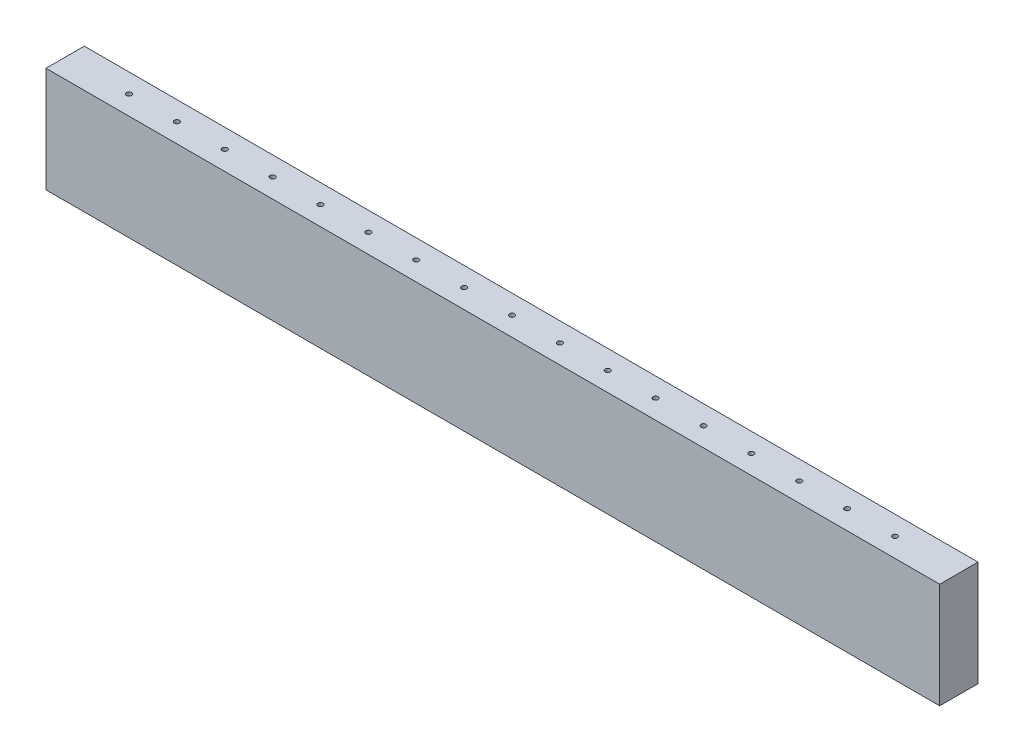
ISO-10303-21;
HEADER;
FILE_DESCRIPTION(('STEP AP214'),'2;1');
FILE_NAME('part.step','',(''),(''),'','','');
FILE_SCHEMA(('AUTOMOTIVE_DESIGN { 1 0 10303 214 1 1 1 1 }'));
ENDSEC;
DATA;
#1=APPLICATION_CONTEXT('core data for automotive mechanical design processes');
#2=APPLICATION_PROTOCOL_DEFINITION('international standard','automotive_design',2000,#1);
#3=PRODUCT_CONTEXT('',#1,'mechanical');
#4=PRODUCT('Part','Part','',(#3));
#5=PRODUCT_RELATED_PRODUCT_CATEGORY('part','',(#4));
#6=PRODUCT_DEFINITION_FORMATION('','',#4);
#7=PRODUCT_DEFINITION_CONTEXT('part definition',#1,'design');
#8=PRODUCT_DEFINITION('design','',#6,#7);
#9=PRODUCT_DEFINITION_SHAPE('','',#8);
#10=(LENGTH_UNIT() NAMED_UNIT(*) SI_UNIT(.MILLI.,.METRE.));
#11=(NAMED_UNIT(*) PLANE_ANGLE_UNIT() SI_UNIT($,.RADIAN.));
#12=(NAMED_UNIT(*) SI_UNIT($,.STERADIAN.) SOLID_ANGLE_UNIT());
#13=UNCERTAINTY_MEASURE_WITH_UNIT(LENGTH_MEASURE(1.E-05),#10,'distance_accuracy_value','');
#14=(GEOMETRIC_REPRESENTATION_CONTEXT(3) GLOBAL_UNCERTAINTY_ASSIGNED_CONTEXT((#13)) GLOBAL_UNIT_ASSIGNED_CONTEXT((#10,
#11,#12)) REPRESENTATION_CONTEXT('',''));
#15=CARTESIAN_POINT('',(0.,0.,0.));
#16=DIRECTION('',(0.,0.,1.));
#17=DIRECTION('',(1.,0.,0.));
#18=AXIS2_PLACEMENT_3D('',#15,#16,#17);
#19=CARTESIAN_POINT('',(140.,33.,-6.));
#20=DIRECTION('',(-1.,0.,0.));
#21=DIRECTION('',(0.,0.,1.));
#22=AXIS2_PLACEMENT_3D('',#19,#20,#21);
#23=PLANE('',#22);
#24=DIRECTION('',(0.,0.,-1.));
#25=VECTOR('',#24,1.);
#26=CARTESIAN_POINT('',(140.,0.,-6.));
#27=LINE('',#26,#25);
#28=CARTESIAN_POINT('',(140.,0.,6.));
#29=VERTEX_POINT('',#28);
#30=CARTESIAN_POINT('',(140.,0.,-6.));
#31=VERTEX_POINT('',#30);
#32=EDGE_CURVE('E311',#29,#31,#27,.T.);
#33=ORIENTED_EDGE('',*,*,#32,.T.);
#34=DIRECTION('',(0.,-1.,0.));
#35=VECTOR('',#34,1.);
#36=CARTESIAN_POINT('',(140.,33.,-6.));
#37=LINE('',#36,#35);
#38=CARTESIAN_POINT('',(140.,33.,-6.));
#39=VERTEX_POINT('',#38);
#40=EDGE_CURVE('E11',#39,#31,#37,.T.);
#41=ORIENTED_EDGE('',*,*,#40,.F.);
#42=DIRECTION('',(0.,0.,-1.));
#43=VECTOR('',#42,1.);
#44=CARTESIAN_POINT('',(140.,33.,-6.));
#45=LINE('',#44,#43);
#46=CARTESIAN_POINT('',(140.,33.,6.));
#47=VERTEX_POINT('',#46);
#48=EDGE_CURVE('E312',#47,#39,#45,.T.);
#49=ORIENTED_EDGE('',*,*,#48,.F.);
#50=DIRECTION('',(0.,-1.,0.));
#51=VECTOR('',#50,1.);
#52=CARTESIAN_POINT('',(140.,33.,6.));
#53=LINE('',#52,#51);
#54=EDGE_CURVE('E322',#47,#29,#53,.T.);
#55=ORIENTED_EDGE('',*,*,#54,.T.);
#56=EDGE_LOOP('',(#33,#41,#49,#55));
#57=FACE_BOUND('',#56,.T.);
#58=ADVANCED_FACE('F44',(#57),#23,.F.);
#59=CARTESIAN_POINT('',(-140.,33.,-6.));
#60=DIRECTION('',(0.,0.,1.));
#61=DIRECTION('',(1.,0.,0.));
#62=AXIS2_PLACEMENT_3D('',#59,#60,#61);
#63=PLANE('',#62);
#64=DIRECTION('',(-1.,0.,0.));
#65=VECTOR('',#64,1.);
#66=CARTESIAN_POINT('',(-140.,0.,-6.));
#67=LINE('',#66,#65);
#68=CARTESIAN_POINT('',(-140.,0.,-6.));
#69=VERTEX_POINT('',#68);
#70=EDGE_CURVE('E326',#31,#69,#67,.T.);
#71=ORIENTED_EDGE('',*,*,#70,.T.);
#72=DIRECTION('',(0.,-1.,0.));
#73=VECTOR('',#72,1.);
#74=CARTESIAN_POINT('',(-140.,33.,-6.));
#75=LINE('',#74,#73);
#76=CARTESIAN_POINT('',(-140.,33.,-6.));
#77=VERTEX_POINT('',#76);
#78=EDGE_CURVE('E53',#77,#69,#75,.T.);
#79=ORIENTED_EDGE('',*,*,#78,.F.);
#80=DIRECTION('',(-1.,0.,0.));
#81=VECTOR('',#80,1.);
#82=CARTESIAN_POINT('',(-140.,33.,-6.));
#83=LINE('',#82,#81);
#84=EDGE_CURVE('E92',#39,#77,#83,.T.);
#85=ORIENTED_EDGE('',*,*,#84,.F.);
#86=ORIENTED_EDGE('',*,*,#40,.T.);
#87=EDGE_LOOP('',(#71,#79,#85,#86));
#88=FACE_BOUND('',#87,.T.);
#89=ADVANCED_FACE('F357',(#88),#63,.F.);
#90=CARTESIAN_POINT('',(-140.,33.,-6.));
#91=DIRECTION('',(1.,0.,0.));
#92=DIRECTION('',(0.,0.,-1.));
#93=AXIS2_PLACEMENT_3D('',#90,#91,#92);
#94=PLANE('',#93);
#95=DIRECTION('',(0.,0.,1.));
#96=VECTOR('',#95,1.);
#97=CARTESIAN_POINT('',(-140.,0.,-6.));
#98=LINE('',#97,#96);
#99=CARTESIAN_POINT('',(-140.,0.,6.));
#100=VERTEX_POINT('',#99);
#101=EDGE_CURVE('E79',#69,#100,#98,.T.);
#102=ORIENTED_EDGE('',*,*,#101,.T.);
#103=DIRECTION('',(0.,-1.,0.));
#104=VECTOR('',#103,1.);
#105=CARTESIAN_POINT('',(-140.,33.,6.));
#106=LINE('',#105,#104);
#107=CARTESIAN_POINT('',(-140.,33.,6.));
#108=VERTEX_POINT('',#107);
#109=EDGE_CURVE('E335',#108,#100,#106,.T.);
#110=ORIENTED_EDGE('',*,*,#109,.F.);
#111=DIRECTION('',(0.,0.,1.));
#112=VECTOR('',#111,1.);
#113=CARTESIAN_POINT('',(-140.,33.,-6.));
#114=LINE('',#113,#112);
#115=EDGE_CURVE('E317',#77,#108,#114,.T.);
#116=ORIENTED_EDGE('',*,*,#115,.F.);
#117=ORIENTED_EDGE('',*,*,#78,.T.);
#118=EDGE_LOOP('',(#102,#110,#116,#117));
#119=FACE_BOUND('',#118,.T.);
#120=ADVANCED_FACE('F339',(#119),#94,.F.);
#121=CARTESIAN_POINT('',(-140.,33.,6.));
#122=DIRECTION('',(0.,0.,-1.));
#123=DIRECTION('',(-1.,0.,0.));
#124=AXIS2_PLACEMENT_3D('',#121,#122,#123);
#125=PLANE('',#124);
#126=DIRECTION('',(1.,0.,0.));
#127=VECTOR('',#126,1.);
#128=CARTESIAN_POINT('',(-140.,0.,6.));
#129=LINE('',#128,#127);
#130=EDGE_CURVE('E85',#100,#29,#129,.T.);
#131=ORIENTED_EDGE('',*,*,#130,.T.);
#132=ORIENTED_EDGE('',*,*,#54,.F.);
#133=DIRECTION('',(1.,0.,0.));
#134=VECTOR('',#133,1.);
#135=CARTESIAN_POINT('',(-140.,33.,6.));
#136=LINE('',#135,#134);
#137=EDGE_CURVE('E61',#108,#47,#136,.T.);
#138=ORIENTED_EDGE('',*,*,#137,.F.);
#139=ORIENTED_EDGE('',*,*,#109,.T.);
#140=EDGE_LOOP('',(#131,#132,#138,#139));
#141=FACE_BOUND('',#140,.T.);
#142=ADVANCED_FACE('F346',(#141),#125,.F.);
#143=CARTESIAN_POINT('',(0.,33.,0.));
#144=DIRECTION('',(0.,1.,0.));
#145=DIRECTION('',(0.,0.,1.));
#146=AXIS2_PLACEMENT_3D('',#143,#144,#145);
#147=PLANE('',#146);
#148=CARTESIAN_POINT('',(120.,33.,0.));
#149=DIRECTION('',(0.,1.,0.));
#150=DIRECTION('',(0.,0.,1.));
#151=AXIS2_PLACEMENT_3D('',#148,#149,#150);
#152=CIRCLE('',#151,0.799999999999995);
#153=CARTESIAN_POINT('',(120.,33.,0.799999999999995));
#154=VERTEX_POINT('',#153);
#155=EDGE_CURVE('E175',#154,#154,#152,.T.);
#156=ORIENTED_EDGE('',*,*,#155,.F.);
#157=EDGE_LOOP('',(#156));
#158=FACE_BOUND('',#157,.T.);
#159=CARTESIAN_POINT('',(105.,33.,0.));
#160=DIRECTION('',(0.,1.,0.));
#161=DIRECTION('',(0.,0.,1.));
#162=AXIS2_PLACEMENT_3D('',#159,#160,#161);
#163=CIRCLE('',#162,0.799999999999995);
#164=CARTESIAN_POINT('',(105.,33.,0.799999999999995));
#165=VERTEX_POINT('',#164);
#166=EDGE_CURVE('E183',#165,#165,#163,.T.);
#167=ORIENTED_EDGE('',*,*,#166,.F.);
#168=EDGE_LOOP('',(#167));
#169=FACE_BOUND('',#168,.T.);
#170=CARTESIAN_POINT('',(90.,33.,0.));
#171=DIRECTION('',(0.,1.,0.));
#172=DIRECTION('',(0.,0.,1.));
#173=AXIS2_PLACEMENT_3D('',#170,#171,#172);
#174=CIRCLE('',#173,0.799999999999995);
#175=CARTESIAN_POINT('',(90.,33.,0.799999999999995));
#176=VERTEX_POINT('',#175);
#177=EDGE_CURVE('E191',#176,#176,#174,.T.);
#178=ORIENTED_EDGE('',*,*,#177,.F.);
#179=EDGE_LOOP('',(#178));
#180=FACE_BOUND('',#179,.T.);
#181=CARTESIAN_POINT('',(75.,33.,0.));
#182=DIRECTION('',(0.,1.,0.));
#183=DIRECTION('',(0.,0.,1.));
#184=AXIS2_PLACEMENT_3D('',#181,#182,#183);
#185=CIRCLE('',#184,0.799999999999995);
#186=CARTESIAN_POINT('',(75.,33.,0.799999999999995));
#187=VERTEX_POINT('',#186);
#188=EDGE_CURVE('E199',#187,#187,#185,.T.);
#189=ORIENTED_EDGE('',*,*,#188,.F.);
#190=EDGE_LOOP('',(#189));
#191=FACE_BOUND('',#190,.T.);
#192=CARTESIAN_POINT('',(60.,33.,0.));
#193=DIRECTION('',(0.,1.,0.));
#194=DIRECTION('',(0.,0.,1.));
#195=AXIS2_PLACEMENT_3D('',#192,#193,#194);
#196=CIRCLE('',#195,0.799999999999995);
#197=CARTESIAN_POINT('',(60.,33.,0.799999999999995));
#198=VERTEX_POINT('',#197);
#199=EDGE_CURVE('E207',#198,#198,#196,.T.);
#200=ORIENTED_EDGE('',*,*,#199,.F.);
#201=EDGE_LOOP('',(#200));
#202=FACE_BOUND('',#201,.T.);
#203=CARTESIAN_POINT('',(45.,33.,0.));
#204=DIRECTION('',(0.,1.,0.));
#205=DIRECTION('',(0.,0.,1.));
#206=AXIS2_PLACEMENT_3D('',#203,#204,#205);
#207=CIRCLE('',#206,0.799999999999995);
#208=CARTESIAN_POINT('',(45.,33.,0.799999999999995));
#209=VERTEX_POINT('',#208);
#210=EDGE_CURVE('E215',#209,#209,#207,.T.);
#211=ORIENTED_EDGE('',*,*,#210,.F.);
#212=EDGE_LOOP('',(#211));
#213=FACE_BOUND('',#212,.T.);
#214=CARTESIAN_POINT('',(30.,33.,0.));
#215=DIRECTION('',(0.,1.,0.));
#216=DIRECTION('',(0.,0.,1.));
#217=AXIS2_PLACEMENT_3D('',#214,#215,#216);
#218=CIRCLE('',#217,0.799999999999999);
#219=CARTESIAN_POINT('',(30.,33.,0.799999999999999));
#220=VERTEX_POINT('',#219);
#221=EDGE_CURVE('E223',#220,#220,#218,.T.);
#222=ORIENTED_EDGE('',*,*,#221,.F.);
#223=EDGE_LOOP('',(#222));
#224=FACE_BOUND('',#223,.T.);
#225=CARTESIAN_POINT('',(15.,33.,0.));
#226=DIRECTION('',(0.,1.,0.));
#227=DIRECTION('',(0.,0.,1.));
#228=AXIS2_PLACEMENT_3D('',#225,#226,#227);
#229=CIRCLE('',#228,0.799999999999999);
#230=CARTESIAN_POINT('',(15.,33.,0.799999999999999));
#231=VERTEX_POINT('',#230);
#232=EDGE_CURVE('E231',#231,#231,#229,.T.);
#233=ORIENTED_EDGE('',*,*,#232,.F.);
#234=EDGE_LOOP('',(#233));
#235=FACE_BOUND('',#234,.T.);
#236=CARTESIAN_POINT('',(-120.,33.,0.));
#237=DIRECTION('',(0.,1.,0.));
#238=DIRECTION('',(0.,0.,1.));
#239=AXIS2_PLACEMENT_3D('',#236,#237,#238);
#240=CIRCLE('',#239,0.799999999999995);
#241=CARTESIAN_POINT('',(-120.,33.,0.799999999999995));
#242=VERTEX_POINT('',#241);
#243=EDGE_CURVE('E239',#242,#242,#240,.T.);
#244=ORIENTED_EDGE('',*,*,#243,.F.);
#245=EDGE_LOOP('',(#244));
#246=FACE_BOUND('',#245,.T.);
#247=CARTESIAN_POINT('',(-105.,33.,0.));
#248=DIRECTION('',(0.,1.,0.));
#249=DIRECTION('',(0.,0.,1.));
#250=AXIS2_PLACEMENT_3D('',#247,#248,#249);
#251=CIRCLE('',#250,0.799999999999995);
#252=CARTESIAN_POINT('',(-105.,33.,0.799999999999995));
#253=VERTEX_POINT('',#252);
#254=EDGE_CURVE('E247',#253,#253,#251,.T.);
#255=ORIENTED_EDGE('',*,*,#254,.F.);
#256=EDGE_LOOP('',(#255));
#257=FACE_BOUND('',#256,.T.);
#258=CARTESIAN_POINT('',(-90.,33.,0.));
#259=DIRECTION('',(0.,1.,0.));
#260=DIRECTION('',(0.,0.,1.));
#261=AXIS2_PLACEMENT_3D('',#258,#259,#260);
#262=CIRCLE('',#261,0.799999999999995);
#263=CARTESIAN_POINT('',(-90.,33.,0.799999999999995));
#264=VERTEX_POINT('',#263);
#265=EDGE_CURVE('E255',#264,#264,#262,.T.);
#266=ORIENTED_EDGE('',*,*,#265,.F.);
#267=EDGE_LOOP('',(#266));
#268=FACE_BOUND('',#267,.T.);
#269=CARTESIAN_POINT('',(-75.,33.,0.));
#270=DIRECTION('',(0.,1.,0.));
#271=DIRECTION('',(0.,0.,1.));
#272=AXIS2_PLACEMENT_3D('',#269,#270,#271);
#273=CIRCLE('',#272,0.799999999999995);
#274=CARTESIAN_POINT('',(-75.,33.,0.799999999999995));
#275=VERTEX_POINT('',#274);
#276=EDGE_CURVE('E263',#275,#275,#273,.T.);
#277=ORIENTED_EDGE('',*,*,#276,.F.);
#278=EDGE_LOOP('',(#277));
#279=FACE_BOUND('',#278,.T.);
#280=CARTESIAN_POINT('',(-60.,33.,0.));
#281=DIRECTION('',(0.,1.,0.));
#282=DIRECTION('',(0.,0.,1.));
#283=AXIS2_PLACEMENT_3D('',#280,#281,#282);
#284=CIRCLE('',#283,0.799999999999995);
#285=CARTESIAN_POINT('',(-60.,33.,0.799999999999995));
#286=VERTEX_POINT('',#285);
#287=EDGE_CURVE('E271',#286,#286,#284,.T.);
#288=ORIENTED_EDGE('',*,*,#287,.F.);
#289=EDGE_LOOP('',(#288));
#290=FACE_BOUND('',#289,.T.);
#291=CARTESIAN_POINT('',(-45.,33.,0.));
#292=DIRECTION('',(0.,1.,0.));
#293=DIRECTION('',(0.,0.,1.));
#294=AXIS2_PLACEMENT_3D('',#291,#292,#293);
#295=CIRCLE('',#294,0.799999999999995);
#296=CARTESIAN_POINT('',(-45.,33.,0.799999999999995));
#297=VERTEX_POINT('',#296);
#298=EDGE_CURVE('E279',#297,#297,#295,.T.);
#299=ORIENTED_EDGE('',*,*,#298,.F.);
#300=EDGE_LOOP('',(#299));
#301=FACE_BOUND('',#300,.T.);
#302=CARTESIAN_POINT('',(-30.,33.,0.));
#303=DIRECTION('',(0.,1.,0.));
#304=DIRECTION('',(0.,0.,1.));
#305=AXIS2_PLACEMENT_3D('',#302,#303,#304);
#306=CIRCLE('',#305,0.799999999999999);
#307=CARTESIAN_POINT('',(-30.,33.,0.799999999999999));
#308=VERTEX_POINT('',#307);
#309=EDGE_CURVE('E287',#308,#308,#306,.T.);
#310=ORIENTED_EDGE('',*,*,#309,.F.);
#311=EDGE_LOOP('',(#310));
#312=FACE_BOUND('',#311,.T.);
#313=CARTESIAN_POINT('',(-15.,33.,0.));
#314=DIRECTION('',(0.,1.,0.));
#315=DIRECTION('',(0.,0.,1.));
#316=AXIS2_PLACEMENT_3D('',#313,#314,#315);
#317=CIRCLE('',#316,0.799999999999997);
#318=CARTESIAN_POINT('',(-15.,33.,0.799999999999997));
#319=VERTEX_POINT('',#318);
#320=EDGE_CURVE('E295',#319,#319,#317,.T.);
#321=ORIENTED_EDGE('',*,*,#320,.F.);
#322=EDGE_LOOP('',(#321));
#323=FACE_BOUND('',#322,.T.);
#324=CARTESIAN_POINT('',(0.,33.,0.));
#325=DIRECTION('',(0.,1.,0.));
#326=DIRECTION('',(0.,0.,1.));
#327=AXIS2_PLACEMENT_3D('',#324,#325,#326);
#328=CIRCLE('',#327,0.799999999999997);
#329=CARTESIAN_POINT('',(0.,33.,0.799999999999997));
#330=VERTEX_POINT('',#329);
#331=EDGE_CURVE('E303',#330,#330,#328,.T.);
#332=ORIENTED_EDGE('',*,*,#331,.F.);
#333=EDGE_LOOP('',(#332));
#334=FACE_BOUND('',#333,.T.);
#335=ORIENTED_EDGE('',*,*,#48,.T.);
#336=ORIENTED_EDGE('',*,*,#84,.T.);
#337=ORIENTED_EDGE('',*,*,#115,.T.);
#338=ORIENTED_EDGE('',*,*,#137,.T.);
#339=EDGE_LOOP('',(#335,#336,#337,#338));
#340=FACE_BOUND('',#339,.T.);
#341=ADVANCED_FACE('F348',(#158,#169,#180,#191,#202,#213,#224,#235,#246,#257,#268,#279,#290,
#301,#312,#323,#334,#340),#147,.T.);
#342=CARTESIAN_POINT('',(0.,0.,0.));
#343=DIRECTION('',(0.,1.,0.));
#344=DIRECTION('',(0.,0.,1.));
#345=AXIS2_PLACEMENT_3D('',#342,#343,#344);
#346=PLANE('',#345);
#347=CARTESIAN_POINT('',(120.,0.,0.));
#348=DIRECTION('',(0.,-1.,0.));
#349=DIRECTION('',(0.,0.,-1.));
#350=AXIS2_PLACEMENT_3D('',#347,#348,#349);
#351=CIRCLE('',#350,1.65);
#352=CARTESIAN_POINT('',(120.,0.,-1.65));
#353=VERTEX_POINT('',#352);
#354=EDGE_CURVE('E162',#353,#353,#351,.T.);
#355=ORIENTED_EDGE('',*,*,#354,.F.);
#356=EDGE_LOOP('',(#355));
#357=FACE_BOUND('',#356,.T.);
#358=CARTESIAN_POINT('',(-120.,0.,0.));
#359=DIRECTION('',(0.,-1.,0.));
#360=DIRECTION('',(0.,0.,-1.));
#361=AXIS2_PLACEMENT_3D('',#358,#359,#360);
#362=CIRCLE('',#361,1.65);
#363=CARTESIAN_POINT('',(-120.,0.,-1.65));
#364=VERTEX_POINT('',#363);
#365=EDGE_CURVE('E161',#364,#364,#362,.T.);
#366=ORIENTED_EDGE('',*,*,#365,.F.);
#367=EDGE_LOOP('',(#366));
#368=FACE_BOUND('',#367,.T.);
#369=ORIENTED_EDGE('',*,*,#32,.F.);
#370=ORIENTED_EDGE('',*,*,#130,.F.);
#371=ORIENTED_EDGE('',*,*,#101,.F.);
#372=ORIENTED_EDGE('',*,*,#70,.F.);
#373=EDGE_LOOP('',(#369,#370,#371,#372));
#374=FACE_BOUND('',#373,.T.);
#375=ADVANCED_FACE('F342',(#357,#368,#374),#346,.F.);
#376=CARTESIAN_POINT('',(0.,18.,0.));
#377=DIRECTION('',(0.,1.,0.));
#378=DIRECTION('',(0.,0.,1.));
#379=AXIS2_PLACEMENT_3D('',#376,#377,#378);
#380=CONICAL_SURFACE('',#379,0.799999999999997,1.02974425867665);
#381=CARTESIAN_POINT('',(0.,17.519311504778,0.));
#382=VERTEX_POINT('',#381);
#383=VERTEX_LOOP('',#382);
#384=FACE_BOUND('',#383,.T.);
#385=CARTESIAN_POINT('',(0.,18.,0.));
#386=DIRECTION('',(0.,1.,0.));
#387=DIRECTION('',(0.,0.,1.));
#388=AXIS2_PLACEMENT_3D('',#385,#386,#387);
#389=CIRCLE('',#388,0.799999999999997);
#390=CARTESIAN_POINT('',(0.,18.,0.799999999999997));
#391=VERTEX_POINT('',#390);
#392=EDGE_CURVE('E307',#391,#391,#389,.T.);
#393=ORIENTED_EDGE('',*,*,#392,.T.);
#394=EDGE_LOOP('',(#393));
#395=FACE_BOUND('',#394,.T.);
#396=ADVANCED_FACE('F380',(#384,#395),#380,.F.);
#397=CARTESIAN_POINT('',(0.,33.,0.));
#398=DIRECTION('',(0.,1.,0.));
#399=DIRECTION('',(0.,0.,1.));
#400=AXIS2_PLACEMENT_3D('',#397,#398,#399);
#401=CYLINDRICAL_SURFACE('',#400,0.799999999999997);
#402=ORIENTED_EDGE('',*,*,#392,.F.);
#403=EDGE_LOOP('',(#402));
#404=FACE_BOUND('',#403,.T.);
#405=ORIENTED_EDGE('',*,*,#331,.T.);
#406=EDGE_LOOP('',(#405));
#407=FACE_BOUND('',#406,.T.);
#408=ADVANCED_FACE('F385',(#404,#407),#401,.F.);
#409=CARTESIAN_POINT('',(-15.,18.,0.));
#410=DIRECTION('',(0.,1.,0.));
#411=DIRECTION('',(0.,0.,1.));
#412=AXIS2_PLACEMENT_3D('',#409,#410,#411);
#413=CONICAL_SURFACE('',#412,0.799999999999997,1.02974425867665);
#414=CARTESIAN_POINT('',(-15.,17.519311504778,0.));
#415=VERTEX_POINT('',#414);
#416=VERTEX_LOOP('',#415);
#417=FACE_BOUND('',#416,.T.);
#418=CARTESIAN_POINT('',(-15.,18.,0.));
#419=DIRECTION('',(0.,1.,0.));
#420=DIRECTION('',(0.,0.,1.));
#421=AXIS2_PLACEMENT_3D('',#418,#419,#420);
#422=CIRCLE('',#421,0.799999999999997);
#423=CARTESIAN_POINT('',(-15.,18.,0.799999999999997));
#424=VERTEX_POINT('',#423);
#425=EDGE_CURVE('E299',#424,#424,#422,.T.);
#426=ORIENTED_EDGE('',*,*,#425,.T.);
#427=EDGE_LOOP('',(#426));
#428=FACE_BOUND('',#427,.T.);
#429=ADVANCED_FACE('F398',(#417,#428),#413,.F.);
#430=CARTESIAN_POINT('',(-15.,33.,0.));
#431=DIRECTION('',(0.,1.,0.));
#432=DIRECTION('',(0.,0.,1.));
#433=AXIS2_PLACEMENT_3D('',#430,#431,#432);
#434=CYLINDRICAL_SURFACE('',#433,0.799999999999997);
#435=ORIENTED_EDGE('',*,*,#425,.F.);
#436=EDGE_LOOP('',(#435));
#437=FACE_BOUND('',#436,.T.);
#438=ORIENTED_EDGE('',*,*,#320,.T.);
#439=EDGE_LOOP('',(#438));
#440=FACE_BOUND('',#439,.T.);
#441=ADVANCED_FACE('F420',(#437,#440),#434,.F.);
#442=CARTESIAN_POINT('',(-30.,18.,0.));
#443=DIRECTION('',(0.,1.,0.));
#444=DIRECTION('',(0.,0.,1.));
#445=AXIS2_PLACEMENT_3D('',#442,#443,#444);
#446=CONICAL_SURFACE('',#445,0.799999999999999,1.02974425867665);
#447=CARTESIAN_POINT('',(-30.,17.519311504778,0.));
#448=VERTEX_POINT('',#447);
#449=VERTEX_LOOP('',#448);
#450=FACE_BOUND('',#449,.T.);
#451=CARTESIAN_POINT('',(-30.,18.,0.));
#452=DIRECTION('',(0.,1.,0.));
#453=DIRECTION('',(0.,0.,1.));
#454=AXIS2_PLACEMENT_3D('',#451,#452,#453);
#455=CIRCLE('',#454,0.799999999999999);
#456=CARTESIAN_POINT('',(-30.,18.,0.799999999999999));
#457=VERTEX_POINT('',#456);
#458=EDGE_CURVE('E291',#457,#457,#455,.T.);
#459=ORIENTED_EDGE('',*,*,#458,.T.);
#460=EDGE_LOOP('',(#459));
#461=FACE_BOUND('',#460,.T.);
#462=ADVANCED_FACE('F431',(#450,#461),#446,.F.);
#463=CARTESIAN_POINT('',(-30.,33.,0.));
#464=DIRECTION('',(0.,1.,0.));
#465=DIRECTION('',(0.,0.,1.));
#466=AXIS2_PLACEMENT_3D('',#463,#464,#465);
#467=CYLINDRICAL_SURFACE('',#466,0.799999999999999);
#468=ORIENTED_EDGE('',*,*,#458,.F.);
#469=EDGE_LOOP('',(#468));
#470=FACE_BOUND('',#469,.T.);
#471=ORIENTED_EDGE('',*,*,#309,.T.);
#472=EDGE_LOOP('',(#471));
#473=FACE_BOUND('',#472,.T.);
#474=ADVANCED_FACE('F444',(#470,#473),#467,.F.);
#475=CARTESIAN_POINT('',(-45.,18.,0.));
#476=DIRECTION('',(0.,1.,0.));
#477=DIRECTION('',(0.,0.,1.));
#478=AXIS2_PLACEMENT_3D('',#475,#476,#477);
#479=CONICAL_SURFACE('',#478,0.799999999999995,1.02974425867665);
#480=CARTESIAN_POINT('',(-45.,17.519311504778,0.));
#481=VERTEX_POINT('',#480);
#482=VERTEX_LOOP('',#481);
#483=FACE_BOUND('',#482,.T.);
#484=CARTESIAN_POINT('',(-45.,18.,0.));
#485=DIRECTION('',(0.,1.,0.));
#486=DIRECTION('',(0.,0.,1.));
#487=AXIS2_PLACEMENT_3D('',#484,#485,#486);
#488=CIRCLE('',#487,0.799999999999995);
#489=CARTESIAN_POINT('',(-45.,18.,0.799999999999995));
#490=VERTEX_POINT('',#489);
#491=EDGE_CURVE('E283',#490,#490,#488,.T.);
#492=ORIENTED_EDGE('',*,*,#491,.T.);
#493=EDGE_LOOP('',(#492));
#494=FACE_BOUND('',#493,.T.);
#495=ADVANCED_FACE('F455',(#483,#494),#479,.F.);
#496=CARTESIAN_POINT('',(-45.,33.,0.));
#497=DIRECTION('',(0.,1.,0.));
#498=DIRECTION('',(0.,0.,1.));
#499=AXIS2_PLACEMENT_3D('',#496,#497,#498);
#500=CYLINDRICAL_SURFACE('',#499,0.799999999999995);
#501=ORIENTED_EDGE('',*,*,#491,.F.);
#502=EDGE_LOOP('',(#501));
#503=FACE_BOUND('',#502,.T.);
#504=ORIENTED_EDGE('',*,*,#298,.T.);
#505=EDGE_LOOP('',(#504));
#506=FACE_BOUND('',#505,.T.);
#507=ADVANCED_FACE('F467',(#503,#506),#500,.F.);
#508=CARTESIAN_POINT('',(-60.,18.,0.));
#509=DIRECTION('',(0.,1.,0.));
#510=DIRECTION('',(0.,0.,1.));
#511=AXIS2_PLACEMENT_3D('',#508,#509,#510);
#512=CONICAL_SURFACE('',#511,0.799999999999995,1.02974425867665);
#513=CARTESIAN_POINT('',(-60.,17.519311504778,0.));
#514=VERTEX_POINT('',#513);
#515=VERTEX_LOOP('',#514);
#516=FACE_BOUND('',#515,.T.);
#517=CARTESIAN_POINT('',(-60.,18.,0.));
#518=DIRECTION('',(0.,1.,0.));
#519=DIRECTION('',(0.,0.,1.));
#520=AXIS2_PLACEMENT_3D('',#517,#518,#519);
#521=CIRCLE('',#520,0.799999999999995);
#522=CARTESIAN_POINT('',(-60.,18.,0.799999999999995));
#523=VERTEX_POINT('',#522);
#524=EDGE_CURVE('E275',#523,#523,#521,.T.);
#525=ORIENTED_EDGE('',*,*,#524,.T.);
#526=EDGE_LOOP('',(#525));
#527=FACE_BOUND('',#526,.T.);
#528=ADVANCED_FACE('F478',(#516,#527),#512,.F.);
#529=CARTESIAN_POINT('',(-60.,33.,0.));
#530=DIRECTION('',(0.,1.,0.));
#531=DIRECTION('',(0.,0.,1.));
#532=AXIS2_PLACEMENT_3D('',#529,#530,#531);
#533=CYLINDRICAL_SURFACE('',#532,0.799999999999995);
#534=ORIENTED_EDGE('',*,*,#524,.F.);
#535=EDGE_LOOP('',(#534));
#536=FACE_BOUND('',#535,.T.);
#537=ORIENTED_EDGE('',*,*,#287,.T.);
#538=EDGE_LOOP('',(#537));
#539=FACE_BOUND('',#538,.T.);
#540=ADVANCED_FACE('F491',(#536,#539),#533,.F.);
#541=CARTESIAN_POINT('',(-75.,18.,0.));
#542=DIRECTION('',(0.,1.,0.));
#543=DIRECTION('',(0.,0.,1.));
#544=AXIS2_PLACEMENT_3D('',#541,#542,#543);
#545=CONICAL_SURFACE('',#544,0.799999999999995,1.02974425867665);
#546=CARTESIAN_POINT('',(-75.,17.519311504778,0.));
#547=VERTEX_POINT('',#546);
#548=VERTEX_LOOP('',#547);
#549=FACE_BOUND('',#548,.T.);
#550=CARTESIAN_POINT('',(-75.,18.,0.));
#551=DIRECTION('',(0.,1.,0.));
#552=DIRECTION('',(0.,0.,1.));
#553=AXIS2_PLACEMENT_3D('',#550,#551,#552);
#554=CIRCLE('',#553,0.799999999999995);
#555=CARTESIAN_POINT('',(-75.,18.,0.799999999999995));
#556=VERTEX_POINT('',#555);
#557=EDGE_CURVE('E267',#556,#556,#554,.T.);
#558=ORIENTED_EDGE('',*,*,#557,.T.);
#559=EDGE_LOOP('',(#558));
#560=FACE_BOUND('',#559,.T.);
#561=ADVANCED_FACE('F502',(#549,#560),#545,.F.);
#562=CARTESIAN_POINT('',(-75.,33.,0.));
#563=DIRECTION('',(0.,1.,0.));
#564=DIRECTION('',(0.,0.,1.));
#565=AXIS2_PLACEMENT_3D('',#562,#563,#564);
#566=CYLINDRICAL_SURFACE('',#565,0.799999999999995);
#567=ORIENTED_EDGE('',*,*,#557,.F.);
#568=EDGE_LOOP('',(#567));
#569=FACE_BOUND('',#568,.T.);
#570=ORIENTED_EDGE('',*,*,#276,.T.);
#571=EDGE_LOOP('',(#570));
#572=FACE_BOUND('',#571,.T.);
#573=ADVANCED_FACE('F514',(#569,#572),#566,.F.);
#574=CARTESIAN_POINT('',(-90.,18.,0.));
#575=DIRECTION('',(0.,1.,0.));
#576=DIRECTION('',(0.,0.,1.));
#577=AXIS2_PLACEMENT_3D('',#574,#575,#576);
#578=CONICAL_SURFACE('',#577,0.799999999999995,1.02974425867665);
#579=CARTESIAN_POINT('',(-90.,17.519311504778,0.));
#580=VERTEX_POINT('',#579);
#581=VERTEX_LOOP('',#580);
#582=FACE_BOUND('',#581,.T.);
#583=CARTESIAN_POINT('',(-90.,18.,0.));
#584=DIRECTION('',(0.,1.,0.));
#585=DIRECTION('',(0.,0.,1.));
#586=AXIS2_PLACEMENT_3D('',#583,#584,#585);
#587=CIRCLE('',#586,0.799999999999995);
#588=CARTESIAN_POINT('',(-90.,18.,0.799999999999995));
#589=VERTEX_POINT('',#588);
#590=EDGE_CURVE('E259',#589,#589,#587,.T.);
#591=ORIENTED_EDGE('',*,*,#590,.T.);
#592=EDGE_LOOP('',(#591));
#593=FACE_BOUND('',#592,.T.);
#594=ADVANCED_FACE('F524',(#582,#593),#578,.F.);
#595=CARTESIAN_POINT('',(-90.,33.,0.));
#596=DIRECTION('',(0.,1.,0.));
#597=DIRECTION('',(0.,0.,1.));
#598=AXIS2_PLACEMENT_3D('',#595,#596,#597);
#599=CYLINDRICAL_SURFACE('',#598,0.799999999999995);
#600=ORIENTED_EDGE('',*,*,#590,.F.);
#601=EDGE_LOOP('',(#600));
#602=FACE_BOUND('',#601,.T.);
#603=ORIENTED_EDGE('',*,*,#265,.T.);
#604=EDGE_LOOP('',(#603));
#605=FACE_BOUND('',#604,.T.);
#606=ADVANCED_FACE('F535',(#602,#605),#599,.F.);
#607=CARTESIAN_POINT('',(-105.,18.,0.));
#608=DIRECTION('',(0.,1.,0.));
#609=DIRECTION('',(0.,0.,1.));
#610=AXIS2_PLACEMENT_3D('',#607,#608,#609);
#611=CONICAL_SURFACE('',#610,0.799999999999995,1.02974425867665);
#612=CARTESIAN_POINT('',(-105.,17.519311504778,0.));
#613=VERTEX_POINT('',#612);
#614=VERTEX_LOOP('',#613);
#615=FACE_BOUND('',#614,.T.);
#616=CARTESIAN_POINT('',(-105.,18.,0.));
#617=DIRECTION('',(0.,1.,0.));
#618=DIRECTION('',(0.,0.,1.));
#619=AXIS2_PLACEMENT_3D('',#616,#617,#618);
#620=CIRCLE('',#619,0.799999999999995);
#621=CARTESIAN_POINT('',(-105.,18.,0.799999999999995));
#622=VERTEX_POINT('',#621);
#623=EDGE_CURVE('E251',#622,#622,#620,.T.);
#624=ORIENTED_EDGE('',*,*,#623,.T.);
#625=EDGE_LOOP('',(#624));
#626=FACE_BOUND('',#625,.T.);
#627=ADVANCED_FACE('F546',(#615,#626),#611,.F.);
#628=CARTESIAN_POINT('',(-105.,33.,0.));
#629=DIRECTION('',(0.,1.,0.));
#630=DIRECTION('',(0.,0.,1.));
#631=AXIS2_PLACEMENT_3D('',#628,#629,#630);
#632=CYLINDRICAL_SURFACE('',#631,0.799999999999995);
#633=ORIENTED_EDGE('',*,*,#623,.F.);
#634=EDGE_LOOP('',(#633));
#635=FACE_BOUND('',#634,.T.);
#636=ORIENTED_EDGE('',*,*,#254,.T.);
#637=EDGE_LOOP('',(#636));
#638=FACE_BOUND('',#637,.T.);
#639=ADVANCED_FACE('F558',(#635,#638),#632,.F.);
#640=CARTESIAN_POINT('',(-120.,18.,0.));
#641=DIRECTION('',(0.,1.,0.));
#642=DIRECTION('',(0.,0.,1.));
#643=AXIS2_PLACEMENT_3D('',#640,#641,#642);
#644=CONICAL_SURFACE('',#643,0.799999999999995,1.02974425867665);
#645=CARTESIAN_POINT('',(-120.,17.519311504778,0.));
#646=VERTEX_POINT('',#645);
#647=VERTEX_LOOP('',#646);
#648=FACE_BOUND('',#647,.T.);
#649=CARTESIAN_POINT('',(-120.,18.,0.));
#650=DIRECTION('',(0.,1.,0.));
#651=DIRECTION('',(0.,0.,1.));
#652=AXIS2_PLACEMENT_3D('',#649,#650,#651);
#653=CIRCLE('',#652,0.799999999999995);
#654=CARTESIAN_POINT('',(-120.,18.,0.799999999999995));
#655=VERTEX_POINT('',#654);
#656=EDGE_CURVE('E243',#655,#655,#653,.T.);
#657=ORIENTED_EDGE('',*,*,#656,.T.);
#658=EDGE_LOOP('',(#657));
#659=FACE_BOUND('',#658,.T.);
#660=ADVANCED_FACE('F569',(#648,#659),#644,.F.);
#661=CARTESIAN_POINT('',(-120.,33.,0.));
#662=DIRECTION('',(0.,1.,0.));
#663=DIRECTION('',(0.,0.,1.));
#664=AXIS2_PLACEMENT_3D('',#661,#662,#663);
#665=CYLINDRICAL_SURFACE('',#664,0.799999999999995);
#666=ORIENTED_EDGE('',*,*,#656,.F.);
#667=EDGE_LOOP('',(#666));
#668=FACE_BOUND('',#667,.T.);
#669=ORIENTED_EDGE('',*,*,#243,.T.);
#670=EDGE_LOOP('',(#669));
#671=FACE_BOUND('',#670,.T.);
#672=ADVANCED_FACE('F580',(#668,#671),#665,.F.);
#673=CARTESIAN_POINT('',(15.,18.,0.));
#674=DIRECTION('',(0.,1.,0.));
#675=DIRECTION('',(0.,0.,1.));
#676=AXIS2_PLACEMENT_3D('',#673,#674,#675);
#677=CONICAL_SURFACE('',#676,0.799999999999999,1.02974425867665);
#678=CARTESIAN_POINT('',(15.,17.519311504778,0.));
#679=VERTEX_POINT('',#678);
#680=VERTEX_LOOP('',#679);
#681=FACE_BOUND('',#680,.T.);
#682=CARTESIAN_POINT('',(15.,18.,0.));
#683=DIRECTION('',(0.,1.,0.));
#684=DIRECTION('',(0.,0.,1.));
#685=AXIS2_PLACEMENT_3D('',#682,#683,#684);
#686=CIRCLE('',#685,0.799999999999999);
#687=CARTESIAN_POINT('',(15.,18.,0.799999999999999));
#688=VERTEX_POINT('',#687);
#689=EDGE_CURVE('E235',#688,#688,#686,.T.);
#690=ORIENTED_EDGE('',*,*,#689,.T.);
#691=EDGE_LOOP('',(#690));
#692=FACE_BOUND('',#691,.T.);
#693=ADVANCED_FACE('F590',(#681,#692),#677,.F.);
#694=CARTESIAN_POINT('',(15.,33.,0.));
#695=DIRECTION('',(0.,1.,0.));
#696=DIRECTION('',(0.,0.,1.));
#697=AXIS2_PLACEMENT_3D('',#694,#695,#696);
#698=CYLINDRICAL_SURFACE('',#697,0.799999999999999);
#699=ORIENTED_EDGE('',*,*,#689,.F.);
#700=EDGE_LOOP('',(#699));
#701=FACE_BOUND('',#700,.T.);
#702=ORIENTED_EDGE('',*,*,#232,.T.);
#703=EDGE_LOOP('',(#702));
#704=FACE_BOUND('',#703,.T.);
#705=ADVANCED_FACE('F601',(#701,#704),#698,.F.);
#706=CARTESIAN_POINT('',(30.,18.,0.));
#707=DIRECTION('',(0.,1.,0.));
#708=DIRECTION('',(0.,0.,1.));
#709=AXIS2_PLACEMENT_3D('',#706,#707,#708);
#710=CONICAL_SURFACE('',#709,0.799999999999999,1.02974425867665);
#711=CARTESIAN_POINT('',(30.,17.519311504778,0.));
#712=VERTEX_POINT('',#711);
#713=VERTEX_LOOP('',#712);
#714=FACE_BOUND('',#713,.T.);
#715=CARTESIAN_POINT('',(30.,18.,0.));
#716=DIRECTION('',(0.,1.,0.));
#717=DIRECTION('',(0.,0.,1.));
#718=AXIS2_PLACEMENT_3D('',#715,#716,#717);
#719=CIRCLE('',#718,0.799999999999999);
#720=CARTESIAN_POINT('',(30.,18.,0.799999999999999));
#721=VERTEX_POINT('',#720);
#722=EDGE_CURVE('E227',#721,#721,#719,.T.);
#723=ORIENTED_EDGE('',*,*,#722,.T.);
#724=EDGE_LOOP('',(#723));
#725=FACE_BOUND('',#724,.T.);
#726=ADVANCED_FACE('F612',(#714,#725),#710,.F.);
#727=CARTESIAN_POINT('',(30.,33.,0.));
#728=DIRECTION('',(0.,1.,0.));
#729=DIRECTION('',(0.,0.,1.));
#730=AXIS2_PLACEMENT_3D('',#727,#728,#729);
#731=CYLINDRICAL_SURFACE('',#730,0.799999999999999);
#732=ORIENTED_EDGE('',*,*,#722,.F.);
#733=EDGE_LOOP('',(#732));
#734=FACE_BOUND('',#733,.T.);
#735=ORIENTED_EDGE('',*,*,#221,.T.);
#736=EDGE_LOOP('',(#735));
#737=FACE_BOUND('',#736,.T.);
#738=ADVANCED_FACE('F624',(#734,#737),#731,.F.);
#739=CARTESIAN_POINT('',(45.,18.,0.));
#740=DIRECTION('',(0.,1.,0.));
#741=DIRECTION('',(0.,0.,1.));
#742=AXIS2_PLACEMENT_3D('',#739,#740,#741);
#743=CONICAL_SURFACE('',#742,0.799999999999995,1.02974425867665);
#744=CARTESIAN_POINT('',(45.,17.519311504778,0.));
#745=VERTEX_POINT('',#744);
#746=VERTEX_LOOP('',#745);
#747=FACE_BOUND('',#746,.T.);
#748=CARTESIAN_POINT('',(45.,18.,0.));
#749=DIRECTION('',(0.,1.,0.));
#750=DIRECTION('',(0.,0.,1.));
#751=AXIS2_PLACEMENT_3D('',#748,#749,#750);
#752=CIRCLE('',#751,0.799999999999995);
#753=CARTESIAN_POINT('',(45.,18.,0.799999999999995));
#754=VERTEX_POINT('',#753);
#755=EDGE_CURVE('E219',#754,#754,#752,.T.);
#756=ORIENTED_EDGE('',*,*,#755,.T.);
#757=EDGE_LOOP('',(#756));
#758=FACE_BOUND('',#757,.T.);
#759=ADVANCED_FACE('F635',(#747,#758),#743,.F.);
#760=CARTESIAN_POINT('',(45.,33.,0.));
#761=DIRECTION('',(0.,1.,0.));
#762=DIRECTION('',(0.,0.,1.));
#763=AXIS2_PLACEMENT_3D('',#760,#761,#762);
#764=CYLINDRICAL_SURFACE('',#763,0.799999999999995);
#765=ORIENTED_EDGE('',*,*,#755,.F.);
#766=EDGE_LOOP('',(#765));
#767=FACE_BOUND('',#766,.T.);
#768=ORIENTED_EDGE('',*,*,#210,.T.);
#769=EDGE_LOOP('',(#768));
#770=FACE_BOUND('',#769,.T.);
#771=ADVANCED_FACE('F647',(#767,#770),#764,.F.);
#772=CARTESIAN_POINT('',(60.,18.,0.));
#773=DIRECTION('',(0.,1.,0.));
#774=DIRECTION('',(0.,0.,1.));
#775=AXIS2_PLACEMENT_3D('',#772,#773,#774);
#776=CONICAL_SURFACE('',#775,0.799999999999995,1.02974425867665);
#777=CARTESIAN_POINT('',(60.,17.519311504778,0.));
#778=VERTEX_POINT('',#777);
#779=VERTEX_LOOP('',#778);
#780=FACE_BOUND('',#779,.T.);
#781=CARTESIAN_POINT('',(60.,18.,0.));
#782=DIRECTION('',(0.,1.,0.));
#783=DIRECTION('',(0.,0.,1.));
#784=AXIS2_PLACEMENT_3D('',#781,#782,#783);
#785=CIRCLE('',#784,0.799999999999995);
#786=CARTESIAN_POINT('',(60.,18.,0.799999999999995));
#787=VERTEX_POINT('',#786);
#788=EDGE_CURVE('E211',#787,#787,#785,.T.);
#789=ORIENTED_EDGE('',*,*,#788,.T.);
#790=EDGE_LOOP('',(#789));
#791=FACE_BOUND('',#790,.T.);
#792=ADVANCED_FACE('F658',(#780,#791),#776,.F.);
#793=CARTESIAN_POINT('',(60.,33.,0.));
#794=DIRECTION('',(0.,1.,0.));
#795=DIRECTION('',(0.,0.,1.));
#796=AXIS2_PLACEMENT_3D('',#793,#794,#795);
#797=CYLINDRICAL_SURFACE('',#796,0.799999999999995);
#798=ORIENTED_EDGE('',*,*,#788,.F.);
#799=EDGE_LOOP('',(#798));
#800=FACE_BOUND('',#799,.T.);
#801=ORIENTED_EDGE('',*,*,#199,.T.);
#802=EDGE_LOOP('',(#801));
#803=FACE_BOUND('',#802,.T.);
#804=ADVANCED_FACE('F669',(#800,#803),#797,.F.);
#805=CARTESIAN_POINT('',(75.,18.,0.));
#806=DIRECTION('',(0.,1.,0.));
#807=DIRECTION('',(0.,0.,1.));
#808=AXIS2_PLACEMENT_3D('',#805,#806,#807);
#809=CONICAL_SURFACE('',#808,0.799999999999995,1.02974425867665);
#810=CARTESIAN_POINT('',(75.,17.519311504778,0.));
#811=VERTEX_POINT('',#810);
#812=VERTEX_LOOP('',#811);
#813=FACE_BOUND('',#812,.T.);
#814=CARTESIAN_POINT('',(75.,18.,0.));
#815=DIRECTION('',(0.,1.,0.));
#816=DIRECTION('',(0.,0.,1.));
#817=AXIS2_PLACEMENT_3D('',#814,#815,#816);
#818=CIRCLE('',#817,0.799999999999995);
#819=CARTESIAN_POINT('',(75.,18.,0.799999999999995));
#820=VERTEX_POINT('',#819);
#821=EDGE_CURVE('E203',#820,#820,#818,.T.);
#822=ORIENTED_EDGE('',*,*,#821,.T.);
#823=EDGE_LOOP('',(#822));
#824=FACE_BOUND('',#823,.T.);
#825=ADVANCED_FACE('F680',(#813,#824),#809,.F.);
#826=CARTESIAN_POINT('',(75.,33.,0.));
#827=DIRECTION('',(0.,1.,0.));
#828=DIRECTION('',(0.,0.,1.));
#829=AXIS2_PLACEMENT_3D('',#826,#827,#828);
#830=CYLINDRICAL_SURFACE('',#829,0.799999999999995);
#831=ORIENTED_EDGE('',*,*,#821,.F.);
#832=EDGE_LOOP('',(#831));
#833=FACE_BOUND('',#832,.T.);
#834=ORIENTED_EDGE('',*,*,#188,.T.);
#835=EDGE_LOOP('',(#834));
#836=FACE_BOUND('',#835,.T.);
#837=ADVANCED_FACE('F692',(#833,#836),#830,.F.);
#838=CARTESIAN_POINT('',(90.,18.,0.));
#839=DIRECTION('',(0.,1.,0.));
#840=DIRECTION('',(0.,0.,1.));
#841=AXIS2_PLACEMENT_3D('',#838,#839,#840);
#842=CONICAL_SURFACE('',#841,0.799999999999995,1.02974425867665);
#843=CARTESIAN_POINT('',(90.,17.519311504778,0.));
#844=VERTEX_POINT('',#843);
#845=VERTEX_LOOP('',#844);
#846=FACE_BOUND('',#845,.T.);
#847=CARTESIAN_POINT('',(90.,18.,0.));
#848=DIRECTION('',(0.,1.,0.));
#849=DIRECTION('',(0.,0.,1.));
#850=AXIS2_PLACEMENT_3D('',#847,#848,#849);
#851=CIRCLE('',#850,0.799999999999995);
#852=CARTESIAN_POINT('',(90.,18.,0.799999999999995));
#853=VERTEX_POINT('',#852);
#854=EDGE_CURVE('E195',#853,#853,#851,.T.);
#855=ORIENTED_EDGE('',*,*,#854,.T.);
#856=EDGE_LOOP('',(#855));
#857=FACE_BOUND('',#856,.T.);
#858=ADVANCED_FACE('F703',(#846,#857),#842,.F.);
#859=CARTESIAN_POINT('',(90.,33.,0.));
#860=DIRECTION('',(0.,1.,0.));
#861=DIRECTION('',(0.,0.,1.));
#862=AXIS2_PLACEMENT_3D('',#859,#860,#861);
#863=CYLINDRICAL_SURFACE('',#862,0.799999999999995);
#864=ORIENTED_EDGE('',*,*,#854,.F.);
#865=EDGE_LOOP('',(#864));
#866=FACE_BOUND('',#865,.T.);
#867=ORIENTED_EDGE('',*,*,#177,.T.);
#868=EDGE_LOOP('',(#867));
#869=FACE_BOUND('',#868,.T.);
#870=ADVANCED_FACE('F715',(#866,#869),#863,.F.);
#871=CARTESIAN_POINT('',(105.,18.,0.));
#872=DIRECTION('',(0.,1.,0.));
#873=DIRECTION('',(0.,0.,1.));
#874=AXIS2_PLACEMENT_3D('',#871,#872,#873);
#875=CONICAL_SURFACE('',#874,0.799999999999995,1.02974425867665);
#876=CARTESIAN_POINT('',(105.,17.519311504778,0.));
#877=VERTEX_POINT('',#876);
#878=VERTEX_LOOP('',#877);
#879=FACE_BOUND('',#878,.T.);
#880=CARTESIAN_POINT('',(105.,18.,0.));
#881=DIRECTION('',(0.,1.,0.));
#882=DIRECTION('',(0.,0.,1.));
#883=AXIS2_PLACEMENT_3D('',#880,#881,#882);
#884=CIRCLE('',#883,0.799999999999995);
#885=CARTESIAN_POINT('',(105.,18.,0.799999999999995));
#886=VERTEX_POINT('',#885);
#887=EDGE_CURVE('E187',#886,#886,#884,.T.);
#888=ORIENTED_EDGE('',*,*,#887,.T.);
#889=EDGE_LOOP('',(#888));
#890=FACE_BOUND('',#889,.T.);
#891=ADVANCED_FACE('F726',(#879,#890),#875,.F.);
#892=CARTESIAN_POINT('',(105.,33.,0.));
#893=DIRECTION('',(0.,1.,0.));
#894=DIRECTION('',(0.,0.,1.));
#895=AXIS2_PLACEMENT_3D('',#892,#893,#894);
#896=CYLINDRICAL_SURFACE('',#895,0.799999999999995);
#897=ORIENTED_EDGE('',*,*,#887,.F.);
#898=EDGE_LOOP('',(#897));
#899=FACE_BOUND('',#898,.T.);
#900=ORIENTED_EDGE('',*,*,#166,.T.);
#901=EDGE_LOOP('',(#900));
#902=FACE_BOUND('',#901,.T.);
#903=ADVANCED_FACE('F738',(#899,#902),#896,.F.);
#904=CARTESIAN_POINT('',(120.,18.,0.));
#905=DIRECTION('',(0.,1.,0.));
#906=DIRECTION('',(0.,0.,1.));
#907=AXIS2_PLACEMENT_3D('',#904,#905,#906);
#908=CONICAL_SURFACE('',#907,0.799999999999995,1.02974425867665);
#909=CARTESIAN_POINT('',(120.,17.519311504778,0.));
#910=VERTEX_POINT('',#909);
#911=VERTEX_LOOP('',#910);
#912=FACE_BOUND('',#911,.T.);
#913=CARTESIAN_POINT('',(120.,18.,0.));
#914=DIRECTION('',(0.,1.,0.));
#915=DIRECTION('',(0.,0.,1.));
#916=AXIS2_PLACEMENT_3D('',#913,#914,#915);
#917=CIRCLE('',#916,0.799999999999995);
#918=CARTESIAN_POINT('',(120.,18.,0.799999999999995));
#919=VERTEX_POINT('',#918);
#920=EDGE_CURVE('E179',#919,#919,#917,.T.);
#921=ORIENTED_EDGE('',*,*,#920,.T.);
#922=EDGE_LOOP('',(#921));
#923=FACE_BOUND('',#922,.T.);
#924=ADVANCED_FACE('F749',(#912,#923),#908,.F.);
#925=CARTESIAN_POINT('',(120.,33.,0.));
#926=DIRECTION('',(0.,1.,0.));
#927=DIRECTION('',(0.,0.,1.));
#928=AXIS2_PLACEMENT_3D('',#925,#926,#927);
#929=CYLINDRICAL_SURFACE('',#928,0.799999999999995);
#930=ORIENTED_EDGE('',*,*,#920,.F.);
#931=EDGE_LOOP('',(#930));
#932=FACE_BOUND('',#931,.T.);
#933=ORIENTED_EDGE('',*,*,#155,.T.);
#934=EDGE_LOOP('',(#933));
#935=FACE_BOUND('',#934,.T.);
#936=ADVANCED_FACE('F761',(#932,#935),#929,.F.);
#937=CARTESIAN_POINT('',(-120.,15.,0.));
#938=DIRECTION('',(0.,-1.,0.));
#939=DIRECTION('',(0.,0.,-1.));
#940=AXIS2_PLACEMENT_3D('',#937,#938,#939);
#941=CONICAL_SURFACE('',#940,1.65,1.02974425867665);
#942=CARTESIAN_POINT('',(-120.,15.9914200213955,0.));
#943=VERTEX_POINT('',#942);
#944=VERTEX_LOOP('',#943);
#945=FACE_BOUND('',#944,.T.);
#946=CARTESIAN_POINT('',(-120.,15.,0.));
#947=DIRECTION('',(0.,-1.,0.));
#948=DIRECTION('',(0.,0.,-1.));
#949=AXIS2_PLACEMENT_3D('',#946,#947,#948);
#950=CIRCLE('',#949,1.65);
#951=CARTESIAN_POINT('',(-120.,15.,-1.65));
#952=VERTEX_POINT('',#951);
#953=EDGE_CURVE('E167',#952,#952,#950,.T.);
#954=ORIENTED_EDGE('',*,*,#953,.T.);
#955=EDGE_LOOP('',(#954));
#956=FACE_BOUND('',#955,.T.);
#957=ADVANCED_FACE('F772',(#945,#956),#941,.F.);
#958=CARTESIAN_POINT('',(-120.,0.,0.));
#959=DIRECTION('',(0.,-1.,0.));
#960=DIRECTION('',(0.,0.,-1.));
#961=AXIS2_PLACEMENT_3D('',#958,#959,#960);
#962=CYLINDRICAL_SURFACE('',#961,1.65);
#963=ORIENTED_EDGE('',*,*,#953,.F.);
#964=EDGE_LOOP('',(#963));
#965=FACE_BOUND('',#964,.T.);
#966=ORIENTED_EDGE('',*,*,#365,.T.);
#967=EDGE_LOOP('',(#966));
#968=FACE_BOUND('',#967,.T.);
#969=ADVANCED_FACE('F154',(#965,#968),#962,.F.);
#970=CARTESIAN_POINT('',(120.,15.,0.));
#971=DIRECTION('',(0.,-1.,0.));
#972=DIRECTION('',(0.,0.,-1.));
#973=AXIS2_PLACEMENT_3D('',#970,#971,#972);
#974=CONICAL_SURFACE('',#973,1.65,1.02974425867665);
#975=CARTESIAN_POINT('',(120.,15.9914200213955,0.));
#976=VERTEX_POINT('',#975);
#977=VERTEX_LOOP('',#976);
#978=FACE_BOUND('',#977,.T.);
#979=CARTESIAN_POINT('',(120.,15.,0.));
#980=DIRECTION('',(0.,-1.,0.));
#981=DIRECTION('',(0.,0.,-1.));
#982=AXIS2_PLACEMENT_3D('',#979,#980,#981);
#983=CIRCLE('',#982,1.65);
#984=CARTESIAN_POINT('',(120.,15.,-1.65));
#985=VERTEX_POINT('',#984);
#986=EDGE_CURVE('E158',#985,#985,#983,.T.);
#987=ORIENTED_EDGE('',*,*,#986,.T.);
#988=EDGE_LOOP('',(#987));
#989=FACE_BOUND('',#988,.T.);
#990=ADVANCED_FACE('F150',(#978,#989),#974,.F.);
#991=CARTESIAN_POINT('',(120.,0.,0.));
#992=DIRECTION('',(0.,-1.,0.));
#993=DIRECTION('',(0.,0.,-1.));
#994=AXIS2_PLACEMENT_3D('',#991,#992,#993);
#995=CYLINDRICAL_SURFACE('',#994,1.65);
#996=ORIENTED_EDGE('',*,*,#986,.F.);
#997=EDGE_LOOP('',(#996));
#998=FACE_BOUND('',#997,.T.);
#999=ORIENTED_EDGE('',*,*,#354,.T.);
#1000=EDGE_LOOP('',(#999));
#1001=FACE_BOUND('',#1000,.T.);
#1002=ADVANCED_FACE('F153',(#998,#1001),#995,.F.);
#1003=CLOSED_SHELL('',(#58,#89,#120,#142,#341,#375,#396,#408,#429,#441,#462,#474,#495,#507,#528,
#540,#561,#573,#594,#606,#627,#639,#660,#672,#693,#705,#726,#738,#759,#771,#792,#804,#825,#837,
#858,#870,#891,#903,#924,#936,#957,#969,#990,#1002));
#1004=MANIFOLD_SOLID_BREP('B2',#1003);
#1005=ADVANCED_BREP_SHAPE_REPRESENTATION('',(#18,#1004),#14);
#1006=SHAPE_DEFINITION_REPRESENTATION(#9,#1005);
ENDSEC;
END-ISO-10303-21;
